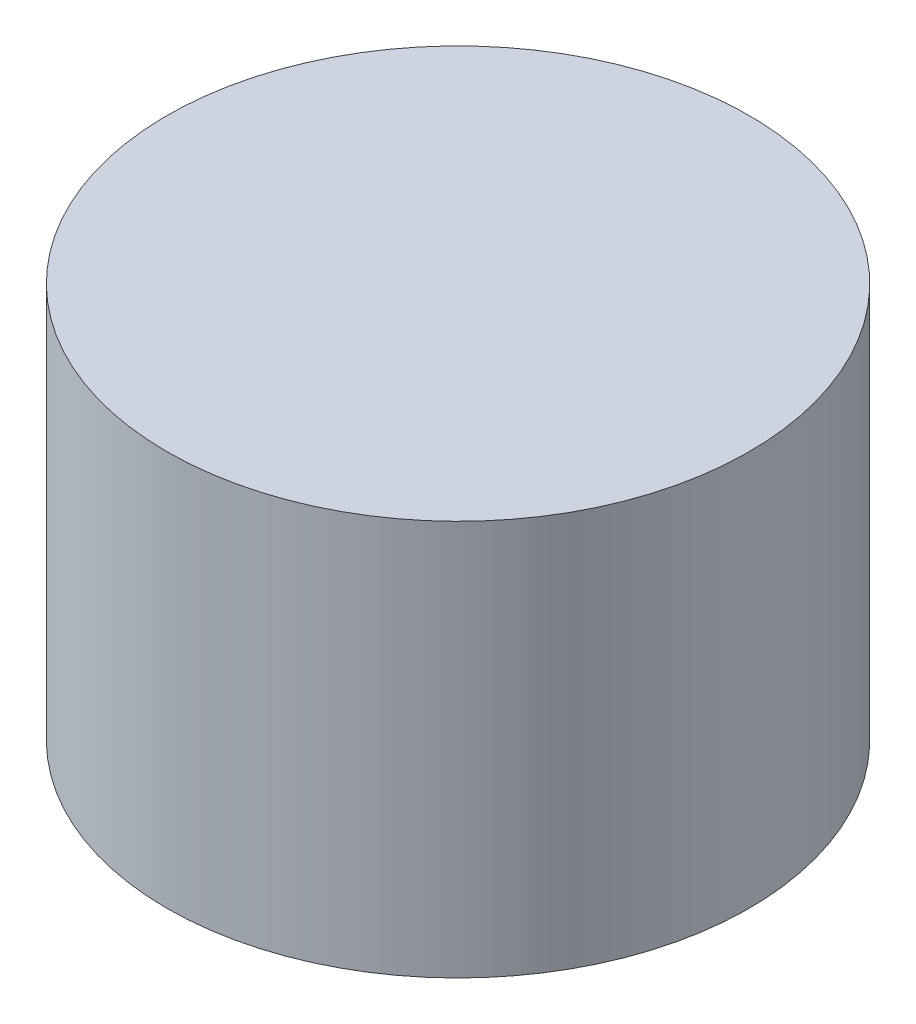
ISO-10303-21;
HEADER;
FILE_DESCRIPTION(('STEP AP214'),'2;1');
FILE_NAME('part.step','',(''),(''),'','','');
FILE_SCHEMA(('AUTOMOTIVE_DESIGN { 1 0 10303 214 1 1 1 1 }'));
ENDSEC;
DATA;
#1=APPLICATION_CONTEXT('core data for automotive mechanical design processes');
#2=APPLICATION_PROTOCOL_DEFINITION('international standard','automotive_design',2000,#1);
#3=PRODUCT_CONTEXT('',#1,'mechanical');
#4=PRODUCT('Part','Part','',(#3));
#5=PRODUCT_RELATED_PRODUCT_CATEGORY('part','',(#4));
#6=PRODUCT_DEFINITION_FORMATION('','',#4);
#7=PRODUCT_DEFINITION_CONTEXT('part definition',#1,'design');
#8=PRODUCT_DEFINITION('design','',#6,#7);
#9=PRODUCT_DEFINITION_SHAPE('','',#8);
#10=(LENGTH_UNIT() NAMED_UNIT(*) SI_UNIT(.MILLI.,.METRE.));
#11=(NAMED_UNIT(*) PLANE_ANGLE_UNIT() SI_UNIT($,.RADIAN.));
#12=(NAMED_UNIT(*) SI_UNIT($,.STERADIAN.) SOLID_ANGLE_UNIT());
#13=UNCERTAINTY_MEASURE_WITH_UNIT(LENGTH_MEASURE(1.E-05),#10,'distance_accuracy_value','');
#14=(GEOMETRIC_REPRESENTATION_CONTEXT(3) GLOBAL_UNCERTAINTY_ASSIGNED_CONTEXT((#13)) GLOBAL_UNIT_ASSIGNED_CONTEXT((#10,
#11,#12)) REPRESENTATION_CONTEXT('',''));
#15=CARTESIAN_POINT('',(0.,0.,0.));
#16=DIRECTION('',(0.,0.,1.));
#17=DIRECTION('',(1.,0.,0.));
#18=AXIS2_PLACEMENT_3D('',#15,#16,#17);
#19=CARTESIAN_POINT('',(0.,100.,0.));
#20=DIRECTION('',(0.,-1.,0.));
#21=DIRECTION('',(0.,0.,-1.));
#22=AXIS2_PLACEMENT_3D('',#19,#20,#21);
#23=CYLINDRICAL_SURFACE('',#22,73.61);
#24=CARTESIAN_POINT('',(0.,100.,0.));
#25=DIRECTION('',(0.,1.,0.));
#26=DIRECTION('',(0.,0.,1.));
#27=AXIS2_PLACEMENT_3D('',#24,#25,#26);
#28=CIRCLE('',#27,73.61);
#29=CARTESIAN_POINT('',(0.,100.,73.61));
#30=VERTEX_POINT('',#29);
#31=EDGE_CURVE('E10',#30,#30,#28,.T.);
#32=ORIENTED_EDGE('',*,*,#31,.F.);
#33=EDGE_LOOP('',(#32));
#34=FACE_BOUND('',#33,.T.);
#35=CARTESIAN_POINT('',(0.,0.,0.));
#36=DIRECTION('',(0.,1.,0.));
#37=DIRECTION('',(0.,0.,1.));
#38=AXIS2_PLACEMENT_3D('',#35,#36,#37);
#39=CIRCLE('',#38,73.61);
#40=CARTESIAN_POINT('',(0.,0.,73.61));
#41=VERTEX_POINT('',#40);
#42=EDGE_CURVE('E33',#41,#41,#39,.T.);
#43=ORIENTED_EDGE('',*,*,#42,.T.);
#44=EDGE_LOOP('',(#43));
#45=FACE_BOUND('',#44,.T.);
#46=ADVANCED_FACE('F30',(#34,#45),#23,.T.);
#47=CARTESIAN_POINT('',(0.,100.,0.));
#48=DIRECTION('',(0.,1.,0.));
#49=DIRECTION('',(0.,0.,1.));
#50=AXIS2_PLACEMENT_3D('',#47,#48,#49);
#51=PLANE('',#50);
#52=ORIENTED_EDGE('',*,*,#31,.T.);
#53=EDGE_LOOP('',(#52));
#54=FACE_BOUND('',#53,.T.);
#55=ADVANCED_FACE('F45',(#54),#51,.T.);
#56=CARTESIAN_POINT('',(0.,0.,0.));
#57=DIRECTION('',(0.,1.,0.));
#58=DIRECTION('',(0.,0.,1.));
#59=AXIS2_PLACEMENT_3D('',#56,#57,#58);
#60=PLANE('',#59);
#61=ORIENTED_EDGE('',*,*,#42,.F.);
#62=EDGE_LOOP('',(#61));
#63=FACE_BOUND('',#62,.T.);
#64=ADVANCED_FACE('F43',(#63),#60,.F.);
#65=CLOSED_SHELL('',(#46,#55,#64));
#66=MANIFOLD_SOLID_BREP('B2',#65);
#67=ADVANCED_BREP_SHAPE_REPRESENTATION('',(#18,#66),#14);
#68=SHAPE_DEFINITION_REPRESENTATION(#9,#67);
ENDSEC;
END-ISO-10303-21;
